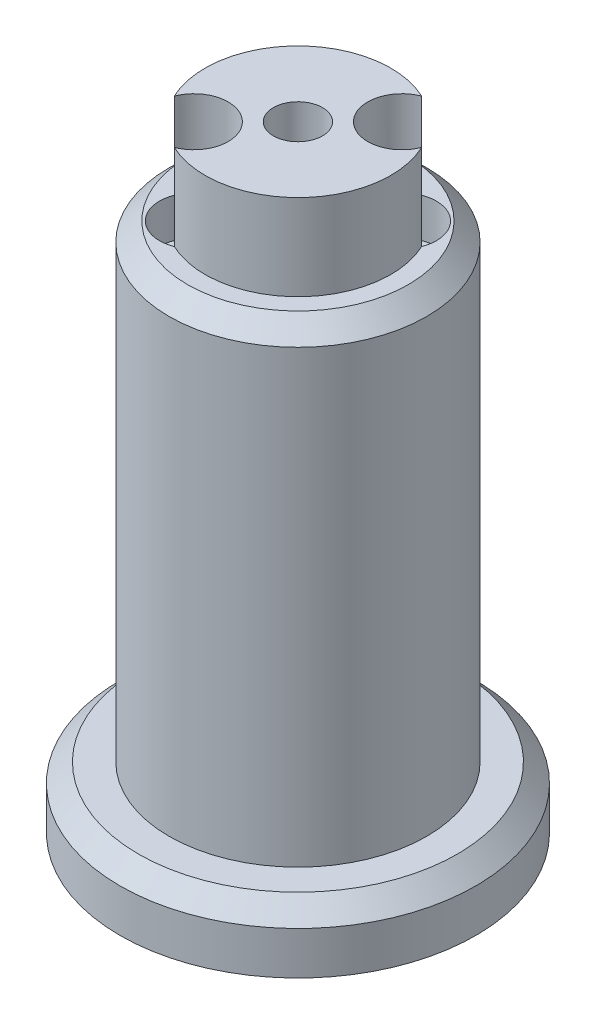
ISO-10303-21;
HEADER;
FILE_DESCRIPTION(('STEP AP214'),'2;1');
FILE_NAME('part.step','',(''),(''),'','','');
FILE_SCHEMA(('AUTOMOTIVE_DESIGN { 1 0 10303 214 1 1 1 1 }'));
ENDSEC;
DATA;
#1=APPLICATION_CONTEXT('core data for automotive mechanical design processes');
#2=APPLICATION_PROTOCOL_DEFINITION('international standard','automotive_design',2000,#1);
#3=PRODUCT_CONTEXT('',#1,'mechanical');
#4=PRODUCT('Part','Part','',(#3));
#5=PRODUCT_RELATED_PRODUCT_CATEGORY('part','',(#4));
#6=PRODUCT_DEFINITION_FORMATION('','',#4);
#7=PRODUCT_DEFINITION_CONTEXT('part definition',#1,'design');
#8=PRODUCT_DEFINITION('design','',#6,#7);
#9=PRODUCT_DEFINITION_SHAPE('','',#8);
#10=(LENGTH_UNIT() NAMED_UNIT(*) SI_UNIT(.MILLI.,.METRE.));
#11=(NAMED_UNIT(*) PLANE_ANGLE_UNIT() SI_UNIT($,.RADIAN.));
#12=(NAMED_UNIT(*) SI_UNIT($,.STERADIAN.) SOLID_ANGLE_UNIT());
#13=UNCERTAINTY_MEASURE_WITH_UNIT(LENGTH_MEASURE(1.E-05),#10,'distance_accuracy_value','');
#14=(GEOMETRIC_REPRESENTATION_CONTEXT(3) GLOBAL_UNCERTAINTY_ASSIGNED_CONTEXT((#13)) GLOBAL_UNIT_ASSIGNED_CONTEXT((#10,
#11,#12)) REPRESENTATION_CONTEXT('',''));
#15=CARTESIAN_POINT('',(0.,0.,0.));
#16=DIRECTION('',(0.,0.,1.));
#17=DIRECTION('',(1.,0.,0.));
#18=AXIS2_PLACEMENT_3D('',#15,#16,#17);
#19=CARTESIAN_POINT('',(4.24264068711931,8.,-4.24264068711926));
#20=DIRECTION('',(0.,-1.,0.));
#21=DIRECTION('',(0.,0.,-1.));
#22=AXIS2_PLACEMENT_3D('',#19,#20,#21);
#23=CYLINDRICAL_SURFACE('',#22,1.5);
#24=CARTESIAN_POINT('',(4.24264068711931,3.,-4.24264068711926));
#25=DIRECTION('',(0.,-1.,0.));
#26=DIRECTION('',(0.,0.,-1.));
#27=AXIS2_PLACEMENT_3D('',#24,#25,#26);
#28=CIRCLE('',#27,1.5);
#29=CARTESIAN_POINT('',(4.24264068711931,3.,-5.74264068711926));
#30=VERTEX_POINT('',#29);
#31=EDGE_CURVE('E121',#30,#30,#28,.T.);
#32=ORIENTED_EDGE('',*,*,#31,.T.);
#33=EDGE_LOOP('',(#32));
#34=FACE_BOUND('',#33,.T.);
#35=CARTESIAN_POINT('',(4.24264068711931,40.,-4.24264068711926));
#36=DIRECTION('',(0.,1.,0.));
#37=DIRECTION('',(0.,0.,1.));
#38=AXIS2_PLACEMENT_3D('',#35,#36,#37);
#39=CIRCLE('',#38,1.5);
#40=CARTESIAN_POINT('',(4.24264068711931,40.,-2.74264068711926));
#41=VERTEX_POINT('',#40);
#42=EDGE_CURVE('E157',#41,#41,#39,.F.);
#43=ORIENTED_EDGE('',*,*,#42,.F.);
#44=EDGE_LOOP('',(#43));
#45=FACE_BOUND('',#44,.T.);
#46=ADVANCED_FACE('F44',(#34,#45),#23,.F.);
#47=CARTESIAN_POINT('',(-4.24264068711931,8.,4.24264068711926));
#48=DIRECTION('',(0.,-1.,0.));
#49=DIRECTION('',(0.,0.,-1.));
#50=AXIS2_PLACEMENT_3D('',#47,#48,#49);
#51=CYLINDRICAL_SURFACE('',#50,1.5);
#52=CARTESIAN_POINT('',(-4.24264068711931,3.,4.24264068711926));
#53=DIRECTION('',(0.,-1.,0.));
#54=DIRECTION('',(0.,0.,-1.));
#55=AXIS2_PLACEMENT_3D('',#52,#53,#54);
#56=CIRCLE('',#55,1.5);
#57=CARTESIAN_POINT('',(-4.24264068711931,3.,2.74264068711926));
#58=VERTEX_POINT('',#57);
#59=EDGE_CURVE('E135',#58,#58,#56,.T.);
#60=ORIENTED_EDGE('',*,*,#59,.T.);
#61=EDGE_LOOP('',(#60));
#62=FACE_BOUND('',#61,.T.);
#63=CARTESIAN_POINT('',(-4.24264068711931,40.,4.24264068711926));
#64=DIRECTION('',(0.,1.,0.));
#65=DIRECTION('',(0.,0.,1.));
#66=AXIS2_PLACEMENT_3D('',#63,#64,#65);
#67=CIRCLE('',#66,1.5);
#68=CARTESIAN_POINT('',(-4.24264068711931,40.,5.74264068711926));
#69=VERTEX_POINT('',#68);
#70=EDGE_CURVE('E153',#69,#69,#67,.F.);
#71=ORIENTED_EDGE('',*,*,#70,.F.);
#72=EDGE_LOOP('',(#71));
#73=FACE_BOUND('',#72,.T.);
#74=ADVANCED_FACE('F185',(#62,#73),#51,.F.);
#75=CARTESIAN_POINT('',(0.,43.2,0.));
#76=DIRECTION('',(0.,1.,0.));
#77=DIRECTION('',(0.,0.,1.));
#78=AXIS2_PLACEMENT_3D('',#75,#76,#77);
#79=CYLINDRICAL_SURFACE('',#78,7.575);
#80=DIRECTION('',(0.,1.,0.));
#81=VECTOR('',#80,1.);
#82=CARTESIAN_POINT('',(3.22852161635685,45.1,-6.85253771771572));
#83=LINE('',#82,#81);
#84=CARTESIAN_POINT('',(3.22852161635685,43.2,-6.85253771771572));
#85=VERTEX_POINT('',#84);
#86=CARTESIAN_POINT('',(3.22852161635685,50.2,-6.85253771771572));
#87=VERTEX_POINT('',#86);
#88=EDGE_CURVE('E66',#85,#87,#83,.T.);
#89=ORIENTED_EDGE('',*,*,#88,.F.);
#90=CARTESIAN_POINT('',(0.,43.2,0.));
#91=DIRECTION('',(0.,1.,0.));
#92=DIRECTION('',(0.,0.,1.));
#93=AXIS2_PLACEMENT_3D('',#90,#91,#92);
#94=CIRCLE('',#93,7.575);
#95=CARTESIAN_POINT('',(-6.85253771771569,43.2,3.22852161635692));
#96=VERTEX_POINT('',#95);
#97=EDGE_CURVE('E101',#85,#96,#94,.T.);
#98=ORIENTED_EDGE('',*,*,#97,.T.);
#99=DIRECTION('',(0.,1.,0.));
#100=VECTOR('',#99,1.);
#101=CARTESIAN_POINT('',(-6.85253771771569,45.1,3.22852161635692));
#102=LINE('',#101,#100);
#103=CARTESIAN_POINT('',(-6.85253771771569,50.2,3.22852161635692));
#104=VERTEX_POINT('',#103);
#105=EDGE_CURVE('E90',#104,#96,#102,.F.);
#106=ORIENTED_EDGE('',*,*,#105,.F.);
#107=CARTESIAN_POINT('',(0.,50.2,0.));
#108=DIRECTION('',(0.,1.,0.));
#109=DIRECTION('',(0.,0.,1.));
#110=AXIS2_PLACEMENT_3D('',#107,#108,#109);
#111=CIRCLE('',#110,7.575);
#112=EDGE_CURVE('E103',#87,#104,#111,.T.);
#113=ORIENTED_EDGE('',*,*,#112,.F.);
#114=EDGE_LOOP('',(#89,#98,#106,#113));
#115=FACE_BOUND('',#114,.T.);
#116=ADVANCED_FACE('F99',(#115),#79,.T.);
#117=CARTESIAN_POINT('',(0.,50.2,0.));
#118=DIRECTION('',(0.,-1.,0.));
#119=DIRECTION('',(0.,0.,-1.));
#120=AXIS2_PLACEMENT_3D('',#117,#118,#119);
#121=CYLINDRICAL_SURFACE('',#120,10.5);
#122=CARTESIAN_POINT('',(0.,41.7,0.));
#123=DIRECTION('',(0.,1.,0.));
#124=DIRECTION('',(0.,0.,1.));
#125=AXIS2_PLACEMENT_3D('',#122,#123,#124);
#126=CIRCLE('',#125,10.5);
#127=CARTESIAN_POINT('',(0.,41.7,10.5));
#128=VERTEX_POINT('',#127);
#129=EDGE_CURVE('E165',#128,#128,#126,.F.);
#130=ORIENTED_EDGE('',*,*,#129,.T.);
#131=EDGE_LOOP('',(#130));
#132=FACE_BOUND('',#131,.T.);
#133=CARTESIAN_POINT('',(0.,5.,0.));
#134=DIRECTION('',(0.,1.,0.));
#135=DIRECTION('',(0.,0.,1.));
#136=AXIS2_PLACEMENT_3D('',#133,#134,#135);
#137=CIRCLE('',#136,10.5);
#138=CARTESIAN_POINT('',(0.,5.,10.5));
#139=VERTEX_POINT('',#138);
#140=EDGE_CURVE('E145',#139,#139,#137,.T.);
#141=ORIENTED_EDGE('',*,*,#140,.T.);
#142=EDGE_LOOP('',(#141));
#143=FACE_BOUND('',#142,.T.);
#144=ADVANCED_FACE('F219',(#132,#143),#121,.T.);
#145=CARTESIAN_POINT('',(0.,5.,0.));
#146=DIRECTION('',(0.,-1.,0.));
#147=DIRECTION('',(0.,0.,-1.));
#148=AXIS2_PLACEMENT_3D('',#145,#146,#147);
#149=CYLINDRICAL_SURFACE('',#148,14.5);
#150=CARTESIAN_POINT('',(0.,3.50000000000001,0.));
#151=DIRECTION('',(0.,1.,0.));
#152=DIRECTION('',(0.,0.,1.));
#153=AXIS2_PLACEMENT_3D('',#150,#151,#152);
#154=CIRCLE('',#153,14.5);
#155=CARTESIAN_POINT('',(0.,3.50000000000001,14.5));
#156=VERTEX_POINT('',#155);
#157=EDGE_CURVE('E11',#156,#156,#154,.F.);
#158=ORIENTED_EDGE('',*,*,#157,.T.);
#159=EDGE_LOOP('',(#158));
#160=FACE_BOUND('',#159,.T.);
#161=CARTESIAN_POINT('',(0.,0.,0.));
#162=DIRECTION('',(0.,1.,0.));
#163=DIRECTION('',(0.,0.,1.));
#164=AXIS2_PLACEMENT_3D('',#161,#162,#163);
#165=CIRCLE('',#164,14.5);
#166=CARTESIAN_POINT('',(0.,0.,14.5));
#167=VERTEX_POINT('',#166);
#168=EDGE_CURVE('E143',#167,#167,#165,.T.);
#169=ORIENTED_EDGE('',*,*,#168,.T.);
#170=EDGE_LOOP('',(#169));
#171=FACE_BOUND('',#170,.T.);
#172=ADVANCED_FACE('F218',(#160,#171),#149,.T.);
#173=CARTESIAN_POINT('',(0.,5.,0.));
#174=DIRECTION('',(0.,1.,0.));
#175=DIRECTION('',(0.,0.,1.));
#176=AXIS2_PLACEMENT_3D('',#173,#174,#175);
#177=PLANE('',#176);
#178=CARTESIAN_POINT('',(0.,5.,0.));
#179=DIRECTION('',(0.,1.,0.));
#180=DIRECTION('',(0.,0.,1.));
#181=AXIS2_PLACEMENT_3D('',#178,#179,#180);
#182=CIRCLE('',#181,13.);
#183=CARTESIAN_POINT('',(0.,5.,13.));
#184=VERTEX_POINT('',#183);
#185=EDGE_CURVE('E53',#184,#184,#182,.T.);
#186=ORIENTED_EDGE('',*,*,#185,.T.);
#187=EDGE_LOOP('',(#186));
#188=FACE_BOUND('',#187,.T.);
#189=ORIENTED_EDGE('',*,*,#140,.F.);
#190=EDGE_LOOP('',(#189));
#191=FACE_BOUND('',#190,.T.);
#192=ADVANCED_FACE('F169',(#188,#191),#177,.T.);
#193=CARTESIAN_POINT('',(0.,0.,0.));
#194=DIRECTION('',(0.,1.,0.));
#195=DIRECTION('',(0.,0.,1.));
#196=AXIS2_PLACEMENT_3D('',#193,#194,#195);
#197=PLANE('',#196);
#198=CARTESIAN_POINT('',(0.,0.,0.));
#199=DIRECTION('',(0.,-1.,0.));
#200=DIRECTION('',(0.,0.,-1.));
#201=AXIS2_PLACEMENT_3D('',#198,#199,#200);
#202=CIRCLE('',#201,13.);
#203=CARTESIAN_POINT('',(0.,0.,-13.));
#204=VERTEX_POINT('',#203);
#205=EDGE_CURVE('E140',#204,#204,#202,.T.);
#206=ORIENTED_EDGE('',*,*,#205,.F.);
#207=EDGE_LOOP('',(#206));
#208=FACE_BOUND('',#207,.T.);
#209=ORIENTED_EDGE('',*,*,#168,.F.);
#210=EDGE_LOOP('',(#209));
#211=FACE_BOUND('',#210,.T.);
#212=ADVANCED_FACE('F229',(#208,#211),#197,.F.);
#213=CARTESIAN_POINT('',(0.,3.,0.));
#214=DIRECTION('',(0.,-1.,0.));
#215=DIRECTION('',(0.,0.,-1.));
#216=AXIS2_PLACEMENT_3D('',#213,#214,#215);
#217=CYLINDRICAL_SURFACE('',#216,13.);
#218=CARTESIAN_POINT('',(0.,3.,0.));
#219=DIRECTION('',(0.,-1.,0.));
#220=DIRECTION('',(0.,0.,-1.));
#221=AXIS2_PLACEMENT_3D('',#218,#219,#220);
#222=CIRCLE('',#221,13.);
#223=CARTESIAN_POINT('',(0.,3.,-13.));
#224=VERTEX_POINT('',#223);
#225=EDGE_CURVE('E147',#224,#224,#222,.T.);
#226=ORIENTED_EDGE('',*,*,#225,.F.);
#227=EDGE_LOOP('',(#226));
#228=FACE_BOUND('',#227,.T.);
#229=ORIENTED_EDGE('',*,*,#205,.T.);
#230=EDGE_LOOP('',(#229));
#231=FACE_BOUND('',#230,.T.);
#232=ADVANCED_FACE('F228',(#228,#231),#217,.F.);
#233=CARTESIAN_POINT('',(0.,3.,0.));
#234=DIRECTION('',(0.,-1.,0.));
#235=DIRECTION('',(0.,0.,-1.));
#236=AXIS2_PLACEMENT_3D('',#233,#234,#235);
#237=PLANE('',#236);
#238=CARTESIAN_POINT('',(0.,3.,0.));
#239=DIRECTION('',(0.,-1.,0.));
#240=DIRECTION('',(0.,0.,-1.));
#241=AXIS2_PLACEMENT_3D('',#238,#239,#240);
#242=CIRCLE('',#241,3.);
#243=CARTESIAN_POINT('',(0.,3.,-3.));
#244=VERTEX_POINT('',#243);
#245=EDGE_CURVE('E119',#244,#244,#242,.T.);
#246=ORIENTED_EDGE('',*,*,#245,.F.);
#247=EDGE_LOOP('',(#246));
#248=FACE_BOUND('',#247,.T.);
#249=ORIENTED_EDGE('',*,*,#59,.F.);
#250=EDGE_LOOP('',(#249));
#251=FACE_BOUND('',#250,.T.);
#252=CARTESIAN_POINT('',(4.24264068711926,3.,4.24264068711931));
#253=DIRECTION('',(0.,-1.,0.));
#254=DIRECTION('',(0.,0.,-1.));
#255=AXIS2_PLACEMENT_3D('',#252,#253,#254);
#256=CIRCLE('',#255,1.5);
#257=CARTESIAN_POINT('',(4.24264068711926,3.,2.74264068711931));
#258=VERTEX_POINT('',#257);
#259=EDGE_CURVE('E130',#258,#258,#256,.T.);
#260=ORIENTED_EDGE('',*,*,#259,.F.);
#261=EDGE_LOOP('',(#260));
#262=FACE_BOUND('',#261,.T.);
#263=ORIENTED_EDGE('',*,*,#31,.F.);
#264=EDGE_LOOP('',(#263));
#265=FACE_BOUND('',#264,.T.);
#266=CARTESIAN_POINT('',(-4.24264068711926,3.,-4.24264068711931));
#267=DIRECTION('',(0.,-1.,0.));
#268=DIRECTION('',(0.,0.,-1.));
#269=AXIS2_PLACEMENT_3D('',#266,#267,#268);
#270=CIRCLE('',#269,1.5);
#271=CARTESIAN_POINT('',(-4.24264068711926,3.,-5.74264068711931));
#272=VERTEX_POINT('',#271);
#273=EDGE_CURVE('E120',#272,#272,#270,.T.);
#274=ORIENTED_EDGE('',*,*,#273,.F.);
#275=EDGE_LOOP('',(#274));
#276=FACE_BOUND('',#275,.T.);
#277=ORIENTED_EDGE('',*,*,#225,.T.);
#278=EDGE_LOOP('',(#277));
#279=FACE_BOUND('',#278,.T.);
#280=ADVANCED_FACE('F224',(#248,#251,#262,#265,#276,#279),#237,.T.);
#281=CARTESIAN_POINT('',(-4.24264068711926,8.,-4.24264068711931));
#282=DIRECTION('',(0.,-1.,0.));
#283=DIRECTION('',(0.,0.,-1.));
#284=AXIS2_PLACEMENT_3D('',#281,#282,#283);
#285=CYLINDRICAL_SURFACE('',#284,1.5);
#286=CARTESIAN_POINT('',(-4.24264068711926,8.,-4.24264068711931));
#287=DIRECTION('',(0.,-1.,0.));
#288=DIRECTION('',(0.,0.,-1.));
#289=AXIS2_PLACEMENT_3D('',#286,#287,#288);
#290=CIRCLE('',#289,1.5);
#291=CARTESIAN_POINT('',(-4.24264068711926,8.,-5.74264068711931));
#292=VERTEX_POINT('',#291);
#293=EDGE_CURVE('E122',#292,#292,#290,.T.);
#294=ORIENTED_EDGE('',*,*,#293,.F.);
#295=EDGE_LOOP('',(#294));
#296=FACE_BOUND('',#295,.T.);
#297=ORIENTED_EDGE('',*,*,#273,.T.);
#298=EDGE_LOOP('',(#297));
#299=FACE_BOUND('',#298,.T.);
#300=ADVANCED_FACE('F221',(#296,#299),#285,.F.);
#301=CARTESIAN_POINT('',(-4.24264068711926,8.,-4.24264068711931));
#302=DIRECTION('',(0.,-1.,0.));
#303=DIRECTION('',(0.,0.,-1.));
#304=AXIS2_PLACEMENT_3D('',#301,#302,#303);
#305=PLANE('',#304);
#306=ORIENTED_EDGE('',*,*,#293,.T.);
#307=EDGE_LOOP('',(#306));
#308=FACE_BOUND('',#307,.T.);
#309=ADVANCED_FACE('F191',(#308),#305,.T.);
#310=CARTESIAN_POINT('',(4.24264068711926,8.,4.24264068711931));
#311=DIRECTION('',(0.,-1.,0.));
#312=DIRECTION('',(0.,0.,-1.));
#313=AXIS2_PLACEMENT_3D('',#310,#311,#312);
#314=CYLINDRICAL_SURFACE('',#313,1.5);
#315=CARTESIAN_POINT('',(4.24264068711926,8.,4.24264068711931));
#316=DIRECTION('',(0.,-1.,0.));
#317=DIRECTION('',(0.,0.,-1.));
#318=AXIS2_PLACEMENT_3D('',#315,#316,#317);
#319=CIRCLE('',#318,1.5);
#320=CARTESIAN_POINT('',(4.24264068711926,8.,2.74264068711931));
#321=VERTEX_POINT('',#320);
#322=EDGE_CURVE('E128',#321,#321,#319,.T.);
#323=ORIENTED_EDGE('',*,*,#322,.F.);
#324=EDGE_LOOP('',(#323));
#325=FACE_BOUND('',#324,.T.);
#326=ORIENTED_EDGE('',*,*,#259,.T.);
#327=EDGE_LOOP('',(#326));
#328=FACE_BOUND('',#327,.T.);
#329=ADVANCED_FACE('F197',(#325,#328),#314,.F.);
#330=CARTESIAN_POINT('',(4.24264068711926,8.,4.24264068711931));
#331=DIRECTION('',(0.,-1.,0.));
#332=DIRECTION('',(0.,0.,-1.));
#333=AXIS2_PLACEMENT_3D('',#330,#331,#332);
#334=PLANE('',#333);
#335=ORIENTED_EDGE('',*,*,#322,.T.);
#336=EDGE_LOOP('',(#335));
#337=FACE_BOUND('',#336,.T.);
#338=ADVANCED_FACE('F196',(#337),#334,.T.);
#339=CARTESIAN_POINT('',(0.,8.,0.));
#340=DIRECTION('',(0.,-1.,0.));
#341=DIRECTION('',(0.,0.,-1.));
#342=AXIS2_PLACEMENT_3D('',#339,#340,#341);
#343=CYLINDRICAL_SURFACE('',#342,3.);
#344=CARTESIAN_POINT('',(0.,8.,0.));
#345=DIRECTION('',(0.,-1.,0.));
#346=DIRECTION('',(0.,0.,-1.));
#347=AXIS2_PLACEMENT_3D('',#344,#345,#346);
#348=CIRCLE('',#347,3.);
#349=CARTESIAN_POINT('',(0.,8.,-3.));
#350=VERTEX_POINT('',#349);
#351=EDGE_CURVE('E138',#350,#350,#348,.T.);
#352=ORIENTED_EDGE('',*,*,#351,.F.);
#353=EDGE_LOOP('',(#352));
#354=FACE_BOUND('',#353,.T.);
#355=ORIENTED_EDGE('',*,*,#245,.T.);
#356=EDGE_LOOP('',(#355));
#357=FACE_BOUND('',#356,.T.);
#358=ADVANCED_FACE('F204',(#354,#357),#343,.F.);
#359=CARTESIAN_POINT('',(0.,8.,0.));
#360=DIRECTION('',(0.,-1.,0.));
#361=DIRECTION('',(0.,0.,-1.));
#362=AXIS2_PLACEMENT_3D('',#359,#360,#361);
#363=PLANE('',#362);
#364=CARTESIAN_POINT('',(0.,8.,0.));
#365=DIRECTION('',(0.,-1.,0.));
#366=DIRECTION('',(0.,0.,-1.));
#367=AXIS2_PLACEMENT_3D('',#364,#365,#366);
#368=CIRCLE('',#367,2.);
#369=CARTESIAN_POINT('',(0.,8.,-2.));
#370=VERTEX_POINT('',#369);
#371=EDGE_CURVE('E112',#370,#370,#368,.T.);
#372=ORIENTED_EDGE('',*,*,#371,.F.);
#373=EDGE_LOOP('',(#372));
#374=FACE_BOUND('',#373,.T.);
#375=ORIENTED_EDGE('',*,*,#351,.T.);
#376=EDGE_LOOP('',(#375));
#377=FACE_BOUND('',#376,.T.);
#378=ADVANCED_FACE('F201',(#374,#377),#363,.T.);
#379=CARTESIAN_POINT('',(0.,43.2,0.));
#380=DIRECTION('',(0.,1.,0.));
#381=DIRECTION('',(0.,0.,1.));
#382=AXIS2_PLACEMENT_3D('',#379,#380,#381);
#383=PLANE('',#382);
#384=CARTESIAN_POINT('',(0.,43.2,0.));
#385=DIRECTION('',(0.,1.,0.));
#386=DIRECTION('',(0.,0.,1.));
#387=AXIS2_PLACEMENT_3D('',#384,#385,#386);
#388=CIRCLE('',#387,8.99999999999999);
#389=CARTESIAN_POINT('',(0.,43.2,8.99999999999999));
#390=VERTEX_POINT('',#389);
#391=EDGE_CURVE('E151',#390,#390,#388,.T.);
#392=ORIENTED_EDGE('',*,*,#391,.T.);
#393=EDGE_LOOP('',(#392));
#394=FACE_BOUND('',#393,.T.);
#395=CARTESIAN_POINT('',(4.24264068711926,43.2,-4.24264068711931));
#396=DIRECTION('',(0.,1.,0.));
#397=DIRECTION('',(0.,0.,1.));
#398=AXIS2_PLACEMENT_3D('',#395,#396,#397);
#399=CIRCLE('',#398,2.8);
#400=CARTESIAN_POINT('',(6.85253771771569,43.2,-3.22852161635692));
#401=VERTEX_POINT('',#400);
#402=EDGE_CURVE('E432',#401,#85,#399,.T.);
#403=ORIENTED_EDGE('',*,*,#402,.F.);
#404=CARTESIAN_POINT('',(-3.22852161635685,43.2,6.85253771771572));
#405=VERTEX_POINT('',#404);
#406=EDGE_CURVE('E107',#405,#401,#94,.T.);
#407=ORIENTED_EDGE('',*,*,#406,.F.);
#408=CARTESIAN_POINT('',(-4.24264068711926,43.2,4.24264068711931));
#409=DIRECTION('',(0.,1.,0.));
#410=DIRECTION('',(0.,0.,1.));
#411=AXIS2_PLACEMENT_3D('',#408,#409,#410);
#412=CIRCLE('',#411,2.8);
#413=EDGE_CURVE('E104',#96,#405,#412,.T.);
#414=ORIENTED_EDGE('',*,*,#413,.F.);
#415=ORIENTED_EDGE('',*,*,#97,.F.);
#416=EDGE_LOOP('',(#403,#407,#414,#415));
#417=FACE_BOUND('',#416,.T.);
#418=ADVANCED_FACE('F206',(#394,#417),#383,.T.);
#419=DIRECTION('',(0.,1.,0.));
#420=VECTOR('',#419,1.);
#421=CARTESIAN_POINT('',(6.85253771771569,45.1,-3.22852161635692));
#422=LINE('',#421,#420);
#423=CARTESIAN_POINT('',(6.85253771771569,50.2,-3.22852161635692));
#424=VERTEX_POINT('',#423);
#425=EDGE_CURVE('E431',#424,#401,#422,.F.);
#426=ORIENTED_EDGE('',*,*,#425,.F.);
#427=CARTESIAN_POINT('',(-3.22852161635685,50.2,6.85253771771572));
#428=VERTEX_POINT('',#427);
#429=EDGE_CURVE('E109',#428,#424,#111,.T.);
#430=ORIENTED_EDGE('',*,*,#429,.F.);
#431=DIRECTION('',(0.,1.,0.));
#432=VECTOR('',#431,1.);
#433=CARTESIAN_POINT('',(-3.22852161635685,45.1,6.85253771771572));
#434=LINE('',#433,#432);
#435=EDGE_CURVE('E62',#405,#428,#434,.T.);
#436=ORIENTED_EDGE('',*,*,#435,.F.);
#437=ORIENTED_EDGE('',*,*,#406,.T.);
#438=EDGE_LOOP('',(#426,#430,#436,#437));
#439=FACE_BOUND('',#438,.T.);
#440=ADVANCED_FACE('F217',(#439),#79,.T.);
#441=CARTESIAN_POINT('',(0.,50.2,0.));
#442=DIRECTION('',(0.,1.,0.));
#443=DIRECTION('',(0.,0.,1.));
#444=AXIS2_PLACEMENT_3D('',#441,#442,#443);
#445=PLANE('',#444);
#446=CARTESIAN_POINT('',(4.24264068711926,50.2,-4.24264068711931));
#447=DIRECTION('',(0.,1.,0.));
#448=DIRECTION('',(0.,0.,1.));
#449=AXIS2_PLACEMENT_3D('',#446,#447,#448);
#450=CIRCLE('',#449,2.8);
#451=EDGE_CURVE('E108',#87,#424,#450,.T.);
#452=ORIENTED_EDGE('',*,*,#451,.F.);
#453=ORIENTED_EDGE('',*,*,#112,.T.);
#454=CARTESIAN_POINT('',(-4.24264068711926,50.2,4.24264068711931));
#455=DIRECTION('',(0.,1.,0.));
#456=DIRECTION('',(0.,0.,1.));
#457=AXIS2_PLACEMENT_3D('',#454,#455,#456);
#458=CIRCLE('',#457,2.8);
#459=EDGE_CURVE('E81',#428,#104,#458,.T.);
#460=ORIENTED_EDGE('',*,*,#459,.F.);
#461=ORIENTED_EDGE('',*,*,#429,.T.);
#462=EDGE_LOOP('',(#452,#453,#460,#461));
#463=FACE_BOUND('',#462,.T.);
#464=CARTESIAN_POINT('',(0.,50.2,0.));
#465=DIRECTION('',(0.,-1.,0.));
#466=DIRECTION('',(0.,0.,-1.));
#467=AXIS2_PLACEMENT_3D('',#464,#465,#466);
#468=CIRCLE('',#467,2.);
#469=CARTESIAN_POINT('',(0.,50.2,-2.));
#470=VERTEX_POINT('',#469);
#471=EDGE_CURVE('E163',#470,#470,#468,.T.);
#472=ORIENTED_EDGE('',*,*,#471,.T.);
#473=EDGE_LOOP('',(#472));
#474=FACE_BOUND('',#473,.T.);
#475=ADVANCED_FACE('F106',(#463,#474),#445,.T.);
#476=CARTESIAN_POINT('',(0.,50.2,0.));
#477=DIRECTION('',(0.,-1.,0.));
#478=DIRECTION('',(0.,0.,-1.));
#479=AXIS2_PLACEMENT_3D('',#476,#477,#478);
#480=CYLINDRICAL_SURFACE('',#479,2.);
#481=ORIENTED_EDGE('',*,*,#371,.T.);
#482=EDGE_LOOP('',(#481));
#483=FACE_BOUND('',#482,.T.);
#484=ORIENTED_EDGE('',*,*,#471,.F.);
#485=EDGE_LOOP('',(#484));
#486=FACE_BOUND('',#485,.T.);
#487=ADVANCED_FACE('F213',(#483,#486),#480,.F.);
#488=CARTESIAN_POINT('',(-4.24264068711926,40.,4.24264068711931));
#489=DIRECTION('',(0.,1.,0.));
#490=DIRECTION('',(0.,0.,1.));
#491=AXIS2_PLACEMENT_3D('',#488,#489,#490);
#492=PLANE('',#491);
#493=CARTESIAN_POINT('',(-4.24264068711926,40.,4.24264068711931));
#494=DIRECTION('',(0.,1.,0.));
#495=DIRECTION('',(0.,0.,1.));
#496=AXIS2_PLACEMENT_3D('',#493,#494,#495);
#497=CIRCLE('',#496,2.8);
#498=CARTESIAN_POINT('',(-4.24264068711926,40.,7.04264068711931));
#499=VERTEX_POINT('',#498);
#500=EDGE_CURVE('E91',#499,#499,#497,.T.);
#501=ORIENTED_EDGE('',*,*,#500,.T.);
#502=EDGE_LOOP('',(#501));
#503=FACE_BOUND('',#502,.T.);
#504=ORIENTED_EDGE('',*,*,#70,.T.);
#505=EDGE_LOOP('',(#504));
#506=FACE_BOUND('',#505,.T.);
#507=ADVANCED_FACE('F302',(#503,#506),#492,.T.);
#508=CARTESIAN_POINT('',(-4.24264068711926,40.,4.24264068711931));
#509=DIRECTION('',(0.,1.,0.));
#510=DIRECTION('',(0.,0.,1.));
#511=AXIS2_PLACEMENT_3D('',#508,#509,#510);
#512=CYLINDRICAL_SURFACE('',#511,2.8);
#513=ORIENTED_EDGE('',*,*,#435,.T.);
#514=ORIENTED_EDGE('',*,*,#459,.T.);
#515=ORIENTED_EDGE('',*,*,#105,.T.);
#516=ORIENTED_EDGE('',*,*,#413,.T.);
#517=EDGE_LOOP('',(#513,#514,#515,#516));
#518=FACE_BOUND('',#517,.T.);
#519=ORIENTED_EDGE('',*,*,#500,.F.);
#520=EDGE_LOOP('',(#519));
#521=FACE_BOUND('',#520,.T.);
#522=ADVANCED_FACE('F87',(#518,#521),#512,.F.);
#523=CARTESIAN_POINT('',(4.24264068711926,40.,-4.24264068711931));
#524=DIRECTION('',(0.,1.,0.));
#525=DIRECTION('',(0.,0.,1.));
#526=AXIS2_PLACEMENT_3D('',#523,#524,#525);
#527=PLANE('',#526);
#528=CARTESIAN_POINT('',(4.24264068711926,40.,-4.24264068711931));
#529=DIRECTION('',(0.,1.,0.));
#530=DIRECTION('',(0.,0.,1.));
#531=AXIS2_PLACEMENT_3D('',#528,#529,#530);
#532=CIRCLE('',#531,2.8);
#533=CARTESIAN_POINT('',(4.24264068711926,40.,-1.44264068711931));
#534=VERTEX_POINT('',#533);
#535=EDGE_CURVE('E95',#534,#534,#532,.T.);
#536=ORIENTED_EDGE('',*,*,#535,.T.);
#537=EDGE_LOOP('',(#536));
#538=FACE_BOUND('',#537,.T.);
#539=ORIENTED_EDGE('',*,*,#42,.T.);
#540=EDGE_LOOP('',(#539));
#541=FACE_BOUND('',#540,.T.);
#542=ADVANCED_FACE('F288',(#538,#541),#527,.T.);
#543=CARTESIAN_POINT('',(4.24264068711926,40.,-4.24264068711931));
#544=DIRECTION('',(0.,1.,0.));
#545=DIRECTION('',(0.,0.,1.));
#546=AXIS2_PLACEMENT_3D('',#543,#544,#545);
#547=CYLINDRICAL_SURFACE('',#546,2.8);
#548=ORIENTED_EDGE('',*,*,#88,.T.);
#549=ORIENTED_EDGE('',*,*,#451,.T.);
#550=ORIENTED_EDGE('',*,*,#425,.T.);
#551=ORIENTED_EDGE('',*,*,#402,.T.);
#552=EDGE_LOOP('',(#548,#549,#550,#551));
#553=FACE_BOUND('',#552,.T.);
#554=ORIENTED_EDGE('',*,*,#535,.F.);
#555=EDGE_LOOP('',(#554));
#556=FACE_BOUND('',#555,.T.);
#557=ADVANCED_FACE('F178',(#553,#556),#547,.F.);
#558=CARTESIAN_POINT('',(0.,43.2,0.));
#559=DIRECTION('',(0.,-1.,0.));
#560=DIRECTION('',(0.,0.,-1.));
#561=AXIS2_PLACEMENT_3D('',#558,#559,#560);
#562=CONICAL_SURFACE('',#561,8.99999999999999,0.785398163397445);
#563=ORIENTED_EDGE('',*,*,#129,.F.);
#564=EDGE_LOOP('',(#563));
#565=FACE_BOUND('',#564,.T.);
#566=ORIENTED_EDGE('',*,*,#391,.F.);
#567=EDGE_LOOP('',(#566));
#568=FACE_BOUND('',#567,.T.);
#569=ADVANCED_FACE('F173',(#565,#568),#562,.T.);
#570=CARTESIAN_POINT('',(0.,5.,0.));
#571=DIRECTION('',(0.,-1.,0.));
#572=DIRECTION('',(0.,0.,-1.));
#573=AXIS2_PLACEMENT_3D('',#570,#571,#572);
#574=CONICAL_SURFACE('',#573,13.,0.78539816339745);
#575=ORIENTED_EDGE('',*,*,#157,.F.);
#576=EDGE_LOOP('',(#575));
#577=FACE_BOUND('',#576,.T.);
#578=ORIENTED_EDGE('',*,*,#185,.F.);
#579=EDGE_LOOP('',(#578));
#580=FACE_BOUND('',#579,.T.);
#581=ADVANCED_FACE('F48',(#577,#580),#574,.T.);
#582=CLOSED_SHELL('',(#46,#74,#116,#144,#172,#192,#212,#232,#280,#300,#309,#329,#338,#358,#378,
#418,#440,#475,#487,#507,#522,#542,#557,#569,#581));
#583=MANIFOLD_SOLID_BREP('B2',#582);
#584=ADVANCED_BREP_SHAPE_REPRESENTATION('',(#18,#583),#14);
#585=SHAPE_DEFINITION_REPRESENTATION(#9,#584);
ENDSEC;
END-ISO-10303-21;
